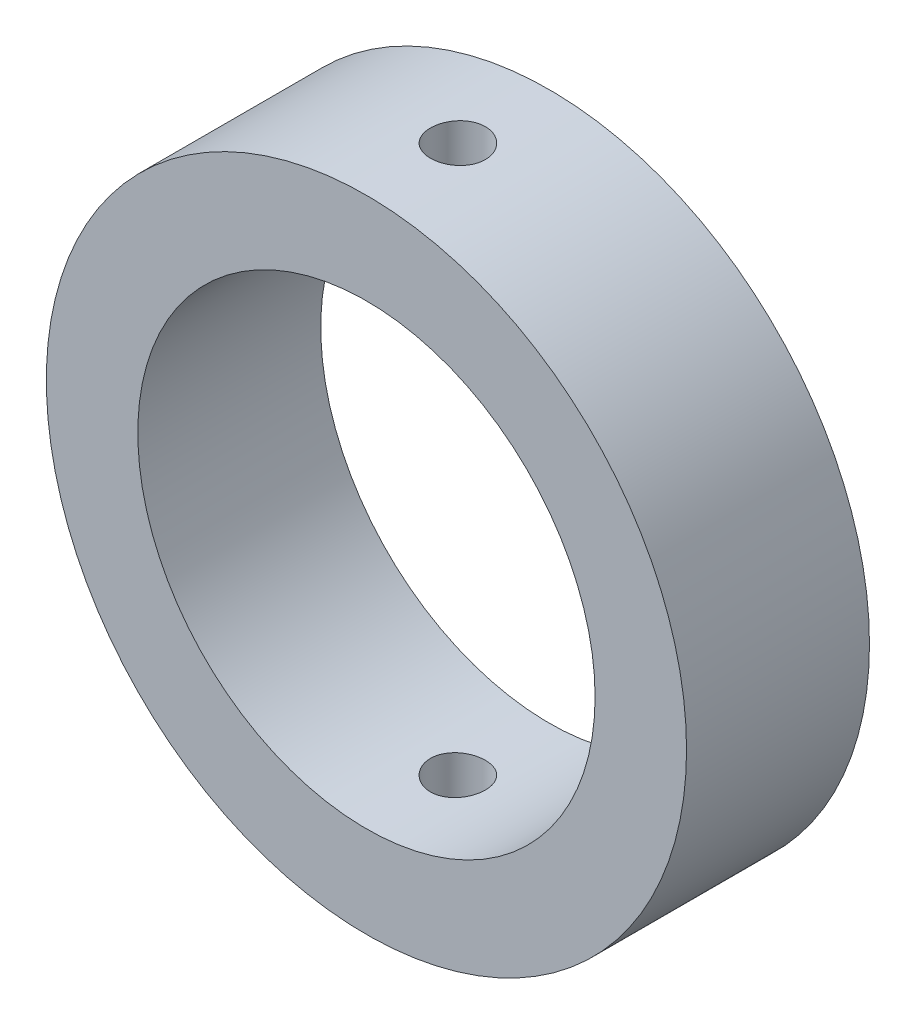
ISO-10303-21;
HEADER;
FILE_DESCRIPTION(('STEP AP214'),'2;1');
FILE_NAME('part.step','',(''),(''),'','','');
FILE_SCHEMA(('AUTOMOTIVE_DESIGN { 1 0 10303 214 1 1 1 1 }'));
ENDSEC;
DATA;
#1=APPLICATION_CONTEXT('core data for automotive mechanical design processes');
#2=APPLICATION_PROTOCOL_DEFINITION('international standard','automotive_design',2000,#1);
#3=PRODUCT_CONTEXT('',#1,'mechanical');
#4=PRODUCT('Part','Part','',(#3));
#5=PRODUCT_RELATED_PRODUCT_CATEGORY('part','',(#4));
#6=PRODUCT_DEFINITION_FORMATION('','',#4);
#7=PRODUCT_DEFINITION_CONTEXT('part definition',#1,'design');
#8=PRODUCT_DEFINITION('design','',#6,#7);
#9=PRODUCT_DEFINITION_SHAPE('','',#8);
#10=(LENGTH_UNIT() NAMED_UNIT(*) SI_UNIT(.MILLI.,.METRE.));
#11=(NAMED_UNIT(*) PLANE_ANGLE_UNIT() SI_UNIT($,.RADIAN.));
#12=(NAMED_UNIT(*) SI_UNIT($,.STERADIAN.) SOLID_ANGLE_UNIT());
#13=UNCERTAINTY_MEASURE_WITH_UNIT(LENGTH_MEASURE(1.E-05),#10,'distance_accuracy_value','');
#14=(GEOMETRIC_REPRESENTATION_CONTEXT(3) GLOBAL_UNCERTAINTY_ASSIGNED_CONTEXT((#13)) GLOBAL_UNIT_ASSIGNED_CONTEXT((#10,
#11,#12)) REPRESENTATION_CONTEXT('',''));
#15=CARTESIAN_POINT('',(0.,0.,0.));
#16=DIRECTION('',(0.,0.,1.));
#17=DIRECTION('',(1.,0.,0.));
#18=AXIS2_PLACEMENT_3D('',#15,#16,#17);
#19=CARTESIAN_POINT('',(0.,0.,10.));
#20=DIRECTION('',(0.,0.,1.));
#21=DIRECTION('',(1.,0.,0.));
#22=AXIS2_PLACEMENT_3D('',#19,#20,#21);
#23=PLANE('',#22);
#24=CARTESIAN_POINT('',(0.,0.,10.));
#25=DIRECTION('',(0.,0.,1.));
#26=DIRECTION('',(1.,0.,0.));
#27=AXIS2_PLACEMENT_3D('',#24,#25,#26);
#28=CIRCLE('',#27,35.);
#29=CARTESIAN_POINT('',(35.,0.,10.));
#30=VERTEX_POINT('',#29);
#31=EDGE_CURVE('E12',#30,#30,#28,.T.);
#32=ORIENTED_EDGE('',*,*,#31,.T.);
#33=EDGE_LOOP('',(#32));
#34=FACE_BOUND('',#33,.T.);
#35=CARTESIAN_POINT('',(0.,0.,10.));
#36=DIRECTION('',(0.,0.,1.));
#37=DIRECTION('',(1.,0.,0.));
#38=AXIS2_PLACEMENT_3D('',#35,#36,#37);
#39=CIRCLE('',#38,25.);
#40=CARTESIAN_POINT('',(25.,0.,10.));
#41=VERTEX_POINT('',#40);
#42=EDGE_CURVE('E67',#41,#41,#39,.T.);
#43=ORIENTED_EDGE('',*,*,#42,.F.);
#44=EDGE_LOOP('',(#43));
#45=FACE_BOUND('',#44,.T.);
#46=ADVANCED_FACE('F48',(#34,#45),#23,.T.);
#47=CARTESIAN_POINT('',(0.,0.,-10.));
#48=DIRECTION('',(0.,0.,1.));
#49=DIRECTION('',(1.,0.,0.));
#50=AXIS2_PLACEMENT_3D('',#47,#48,#49);
#51=PLANE('',#50);
#52=CARTESIAN_POINT('',(0.,0.,-10.));
#53=DIRECTION('',(0.,0.,1.));
#54=DIRECTION('',(1.,0.,0.));
#55=AXIS2_PLACEMENT_3D('',#52,#53,#54);
#56=CIRCLE('',#55,35.);
#57=CARTESIAN_POINT('',(35.,0.,-10.));
#58=VERTEX_POINT('',#57);
#59=EDGE_CURVE('E62',#58,#58,#56,.T.);
#60=ORIENTED_EDGE('',*,*,#59,.F.);
#61=EDGE_LOOP('',(#60));
#62=FACE_BOUND('',#61,.T.);
#63=CARTESIAN_POINT('',(0.,0.,-10.));
#64=DIRECTION('',(0.,0.,1.));
#65=DIRECTION('',(1.,0.,0.));
#66=AXIS2_PLACEMENT_3D('',#63,#64,#65);
#67=CIRCLE('',#66,25.);
#68=CARTESIAN_POINT('',(25.,0.,-10.));
#69=VERTEX_POINT('',#68);
#70=EDGE_CURVE('E70',#69,#69,#67,.T.);
#71=ORIENTED_EDGE('',*,*,#70,.T.);
#72=EDGE_LOOP('',(#71));
#73=FACE_BOUND('',#72,.T.);
#74=ADVANCED_FACE('F106',(#62,#73),#51,.F.);
#75=CARTESIAN_POINT('',(0.,0.,10.));
#76=DIRECTION('',(0.,0.,-1.));
#77=DIRECTION('',(-1.,0.,0.));
#78=AXIS2_PLACEMENT_3D('',#75,#76,#77);
#79=CYLINDRICAL_SURFACE('',#78,35.);
#80=CARTESIAN_POINT('',(0.,-35.,3.));
#81=CARTESIAN_POINT('',(0.168180177421425,-34.9999983189466,2.99999266210863));
#82=CARTESIAN_POINT('',(0.336474410694065,-34.9987748870089,2.98581013771319));
#83=CARTESIAN_POINT('',(0.668405276387218,-34.9940120055983,2.92944276622912));
#84=CARTESIAN_POINT('',(0.832036433522409,-34.9904699418268,2.8872263096079));
#85=CARTESIAN_POINT('',(1.14978580604664,-34.9814700099417,2.77602193084886));
#86=CARTESIAN_POINT('',(1.30390939390644,-34.9760132356579,2.70704929153068));
#87=CARTESIAN_POINT('',(1.5983553572425,-34.9637955952331,2.54431808404178));
#88=CARTESIAN_POINT('',(1.7386806487592,-34.9570350055299,2.45056476836747));
#89=CARTESIAN_POINT('',(2.00196024172095,-34.9429478698077,2.2406617110507));
#90=CARTESIAN_POINT('',(2.12487233650439,-34.9356200130701,2.12445911320051));
#91=CARTESIAN_POINT('',(2.34947428548936,-34.9212352148941,1.87306791064407));
#92=CARTESIAN_POINT('',(2.45116320107853,-34.9141782854488,1.73787846667126));
#93=CARTESIAN_POINT('',(2.63057608789141,-34.9011203668809,1.45209423905735));
#94=CARTESIAN_POINT('',(2.7082627988584,-34.895121025662,1.30147598200075));
#95=CARTESIAN_POINT('',(2.83722803822897,-34.8848727505605,0.989273104177588));
#96=CARTESIAN_POINT('',(2.88850705745045,-34.8806237841455,0.827688687293139));
#97=CARTESIAN_POINT('',(2.96307845769353,-34.8743684880487,0.498564355710717));
#98=CARTESIAN_POINT('',(2.98643979537529,-34.8723566335604,0.331040171612378));
#99=CARTESIAN_POINT('',(3.00472573441206,-34.8707859372111,-0.00556268433017046));
#100=CARTESIAN_POINT('',(2.99965089755265,-34.8712270468893,-0.174641325398614));
#101=CARTESIAN_POINT('',(2.96126551313284,-34.874507414771,-0.509080649907536));
#102=CARTESIAN_POINT('',(2.92802995365881,-34.8773403039272,-0.674450011339011));
#103=CARTESIAN_POINT('',(2.83438308452453,-34.8850750500347,-0.997254501244544));
#104=CARTESIAN_POINT('',(2.77397149596722,-34.8899769282191,-1.15468954827337));
#105=CARTESIAN_POINT('',(2.62760362876988,-34.9013046627491,-1.4573951023907));
#106=CARTESIAN_POINT('',(2.54161375570937,-34.9077325210554,-1.60264928754069));
#107=CARTESIAN_POINT('',(2.34655446417304,-34.9213861292491,-1.87669137617524));
#108=CARTESIAN_POINT('',(2.23748455081154,-34.9286118962437,-2.00547892648475));
#109=CARTESIAN_POINT('',(1.99894091774494,-34.9430754969892,-2.24336792176387));
#110=CARTESIAN_POINT('',(1.86940237855328,-34.9503132942366,-2.35240438166867));
#111=CARTESIAN_POINT('',(1.59382461581758,-34.9639632077666,-2.54719343707745));
#112=CARTESIAN_POINT('',(1.44778538038973,-34.9703753234546,-2.63294601581221));
#113=CARTESIAN_POINT('',(1.1433091368017,-34.9816527329005,-2.7787292518991));
#114=CARTESIAN_POINT('',(0.984870717201056,-34.9865178502383,-2.83875697585377));
#115=CARTESIAN_POINT('',(0.660113221128348,-34.9941511080319,-2.93134075665488));
#116=CARTESIAN_POINT('',(0.493794317781496,-34.9969192945321,-2.96389741671388));
#117=CARTESIAN_POINT('',(0.15856025083397,-35.0000408811527,-3.00053330208984));
#118=CARTESIAN_POINT('',(-0.0103450366761299,-35.0004018916599,-3.00470227713832));
#119=CARTESIAN_POINT('',(-0.346452104482659,-34.9986887867208,-2.98467964423468));
#120=CARTESIAN_POINT('',(-0.513653901587615,-34.9966146953254,-2.96048831639071));
#121=CARTESIAN_POINT('',(-0.841351421558965,-34.9902695086844,-2.88450617766359));
#122=CARTESIAN_POINT('',(-1.00185687270474,-34.9860017297263,-2.83275702283699));
#123=CARTESIAN_POINT('',(-1.31190702245475,-34.9757485102754,-2.70317077993439));
#124=CARTESIAN_POINT('',(-1.46145153801856,-34.9697630411066,-2.62533325632064));
#125=CARTESIAN_POINT('',(-1.74574288167439,-34.9567262474856,-2.44555464705531));
#126=CARTESIAN_POINT('',(-1.88045202960911,-34.9496723123826,-2.34355416847324));
#127=CARTESIAN_POINT('',(-2.13086824169311,-34.9352996751561,-2.11843078007551));
#128=CARTESIAN_POINT('',(-2.24657495644839,-34.9279809681673,-1.99530748196383));
#129=CARTESIAN_POINT('',(-2.45601016602155,-34.9138810732733,-1.73104373026091));
#130=CARTESIAN_POINT('',(-2.54968004901865,-34.9071013498897,-1.58985673643766));
#131=CARTESIAN_POINT('',(-2.71198063229128,-34.8948680127784,-1.29370475497806));
#132=CARTESIAN_POINT('',(-2.78061159495576,-34.8894143851545,-1.1387399117443));
#133=CARTESIAN_POINT('',(-2.8907865424564,-34.8804590783593,-0.819637788875996));
#134=CARTESIAN_POINT('',(-2.93236627395852,-34.8769548240937,-0.655512926555938));
#135=CARTESIAN_POINT('',(-2.98737479633476,-34.872286503041,-0.322579942622132));
#136=CARTESIAN_POINT('',(-3.0008041627162,-34.871122388412,-0.153771916822677));
#137=CARTESIAN_POINT('',(-2.99912392353084,-34.8712668950776,0.183153064790337));
#138=CARTESIAN_POINT('',(-2.98410640669543,-34.8725675374248,0.351270490928937));
#139=CARTESIAN_POINT('',(-2.92615085557176,-34.8774780477604,0.682585927448216));
#140=CARTESIAN_POINT('',(-2.88321277999481,-34.8810879191635,0.845783930553722));
#141=CARTESIAN_POINT('',(-2.7706585792072,-34.8902080316544,1.16263302157389));
#142=CARTESIAN_POINT('',(-2.70104425727074,-34.8957181442861,1.31628475398639));
#143=CARTESIAN_POINT('',(-2.53712384137618,-34.9080181097009,1.60973557579742));
#144=CARTESIAN_POINT('',(-2.4428181018962,-34.9148079441114,1.74953486402647));
#145=CARTESIAN_POINT('',(-2.23184571903132,-34.9289284828144,2.01178384593965));
#146=CARTESIAN_POINT('',(-2.11511080731054,-34.9362607952504,2.13417853301693));
#147=CARTESIAN_POINT('',(-1.86271960746937,-34.9506254222313,2.357688026767));
#148=CARTESIAN_POINT('',(-1.72705875414518,-34.9576576638589,2.45879768438289));
#149=CARTESIAN_POINT('',(-1.44039065385252,-34.9706432183248,2.63701082844132));
#150=CARTESIAN_POINT('',(-1.28935405311577,-34.9765944046818,2.71406721034553));
#151=CARTESIAN_POINT('',(-0.976537475486434,-34.9867226680456,2.84162677766724));
#152=CARTESIAN_POINT('',(-0.81477005805675,-34.9909017781752,2.89216040885072));
#153=CARTESIAN_POINT('',(-0.543377751492648,-34.9959451685553,2.95240549430712));
#154=CARTESIAN_POINT('',(-0.435496910992703,-34.9974587860022,2.97022962445315));
#155=CARTESIAN_POINT('',(-0.218426750644095,-34.999486746251,2.99402924356659));
#156=CARTESIAN_POINT('',(-0.109237434508939,-35.0000010918883,3.00000476615283));
#157=CARTESIAN_POINT('',(0.,-35.,3.));
#158=B_SPLINE_CURVE_WITH_KNOTS('',3,(#80,#81,#82,#83,#84,#85,#86,#87,#88,#89,#90,#91,#92,#93,
#94,#95,#96,#97,#98,#99,#100,#101,#102,#103,#104,#105,#106,#107,#108,#109,#110,#111,#112,#113,
#114,#115,#116,#117,#118,#119,#120,#121,#122,#123,#124,#125,#126,#127,#128,#129,#130,#131,#132,
#133,#134,#135,#136,#137,#138,#139,#140,#141,#142,#143,#144,#145,#146,#147,#148,#149,#150,#151,
#152,#153,#154,#155,#156,#157),.UNSPECIFIED.,.T.,.F.,(4,2,2,2,2,2,2,2,2,2,2,2,2,2,2,2,2,2,2,2,2,
2,2,2,2,2,2,2,2,2,2,2,2,2,2,2,2,2,4),(0.,0.504141688620747,1.00885278730409,1.51327602436422,
2.01759242981481,2.5231110330061,3.02865198843329,3.53497383147414,4.04128626359052,
4.54634550220951,5.05139476290399,5.55510335902216,6.05881712462464,6.56319540924794,
7.06758450992202,7.57360414720596,8.07962414892789,8.58570183661505,9.09176841150507,
9.59623427417642,10.1006951543972,10.6043956535469,11.1081045622491,11.6130646830275,
12.1180340873686,12.6243317573245,13.1306241215114,13.636246082805,14.1418577070399,
14.6458353534655,15.1498137451707,15.6537580747011,16.1576951698375,16.6631911333163,
17.1688092410494,17.6754113983993,18.1814307424438,18.5088849156758,18.8363381597994),.UNSPECIFIED.);
#159=CARTESIAN_POINT('',(0.,-35.,3.));
#160=VERTEX_POINT('',#159);
#161=EDGE_CURVE('E95',#160,#160,#158,.T.);
#162=ORIENTED_EDGE('',*,*,#161,.T.);
#163=EDGE_LOOP('',(#162));
#164=FACE_BOUND('',#163,.T.);
#165=CARTESIAN_POINT('',(0.,35.,3.));
#166=CARTESIAN_POINT('',(-0.168180177421425,34.9999983189466,2.99999266210863));
#167=CARTESIAN_POINT('',(-0.336474410694065,34.9987748870089,2.98581013771319));
#168=CARTESIAN_POINT('',(-0.668405276387218,34.9940120055983,2.92944276622912));
#169=CARTESIAN_POINT('',(-0.832036433522409,34.9904699418268,2.8872263096079));
#170=CARTESIAN_POINT('',(-1.14978580604664,34.9814700099417,2.77602193084886));
#171=CARTESIAN_POINT('',(-1.30390939390644,34.9760132356579,2.70704929153068));
#172=CARTESIAN_POINT('',(-1.5983553572425,34.9637955952331,2.54431808404178));
#173=CARTESIAN_POINT('',(-1.7386806487592,34.9570350055299,2.45056476836747));
#174=CARTESIAN_POINT('',(-2.00196024172095,34.9429478698077,2.2406617110507));
#175=CARTESIAN_POINT('',(-2.12487233650439,34.9356200130701,2.12445911320051));
#176=CARTESIAN_POINT('',(-2.34947428548936,34.9212352148941,1.87306791064407));
#177=CARTESIAN_POINT('',(-2.45116320107853,34.9141782854488,1.73787846667126));
#178=CARTESIAN_POINT('',(-2.63057608789141,34.9011203668809,1.45209423905735));
#179=CARTESIAN_POINT('',(-2.7082627988584,34.895121025662,1.30147598200075));
#180=CARTESIAN_POINT('',(-2.83722803822897,34.8848727505605,0.989273104177588));
#181=CARTESIAN_POINT('',(-2.88850705745045,34.8806237841455,0.827688687293139));
#182=CARTESIAN_POINT('',(-2.96307845769353,34.8743684880487,0.498564355710717));
#183=CARTESIAN_POINT('',(-2.98643979537529,34.8723566335604,0.331040171612378));
#184=CARTESIAN_POINT('',(-3.00472573441206,34.8707859372111,-0.00556268433017046));
#185=CARTESIAN_POINT('',(-2.99965089755265,34.8712270468893,-0.174641325398614));
#186=CARTESIAN_POINT('',(-2.96126551313284,34.874507414771,-0.509080649907536));
#187=CARTESIAN_POINT('',(-2.92802995365881,34.8773403039272,-0.674450011339011));
#188=CARTESIAN_POINT('',(-2.83438308452453,34.8850750500347,-0.997254501244544));
#189=CARTESIAN_POINT('',(-2.77397149596722,34.8899769282191,-1.15468954827337));
#190=CARTESIAN_POINT('',(-2.62760362876988,34.9013046627491,-1.4573951023907));
#191=CARTESIAN_POINT('',(-2.54161375570937,34.9077325210554,-1.60264928754069));
#192=CARTESIAN_POINT('',(-2.34655446417304,34.9213861292491,-1.87669137617524));
#193=CARTESIAN_POINT('',(-2.23748455081154,34.9286118962437,-2.00547892648475));
#194=CARTESIAN_POINT('',(-1.99894091774494,34.9430754969892,-2.24336792176387));
#195=CARTESIAN_POINT('',(-1.86940237855328,34.9503132942366,-2.35240438166867));
#196=CARTESIAN_POINT('',(-1.59382461581758,34.9639632077666,-2.54719343707745));
#197=CARTESIAN_POINT('',(-1.44778538038973,34.9703753234546,-2.63294601581221));
#198=CARTESIAN_POINT('',(-1.1433091368017,34.9816527329005,-2.7787292518991));
#199=CARTESIAN_POINT('',(-0.984870717201056,34.9865178502383,-2.83875697585377));
#200=CARTESIAN_POINT('',(-0.660113221128348,34.9941511080319,-2.93134075665488));
#201=CARTESIAN_POINT('',(-0.493794317781496,34.9969192945321,-2.96389741671388));
#202=CARTESIAN_POINT('',(-0.15856025083397,35.0000408811527,-3.00053330208984));
#203=CARTESIAN_POINT('',(0.0103450366761299,35.0004018916599,-3.00470227713832));
#204=CARTESIAN_POINT('',(0.346452104482659,34.9986887867208,-2.98467964423468));
#205=CARTESIAN_POINT('',(0.513653901587615,34.9966146953254,-2.96048831639071));
#206=CARTESIAN_POINT('',(0.841351421558965,34.9902695086844,-2.88450617766359));
#207=CARTESIAN_POINT('',(1.00185687270474,34.9860017297263,-2.83275702283699));
#208=CARTESIAN_POINT('',(1.31190702245475,34.9757485102754,-2.70317077993439));
#209=CARTESIAN_POINT('',(1.46145153801856,34.9697630411066,-2.62533325632064));
#210=CARTESIAN_POINT('',(1.74574288167439,34.9567262474856,-2.44555464705531));
#211=CARTESIAN_POINT('',(1.88045202960911,34.9496723123826,-2.34355416847324));
#212=CARTESIAN_POINT('',(2.13086824169311,34.9352996751561,-2.11843078007551));
#213=CARTESIAN_POINT('',(2.24657495644839,34.9279809681673,-1.99530748196383));
#214=CARTESIAN_POINT('',(2.45601016602155,34.9138810732733,-1.73104373026091));
#215=CARTESIAN_POINT('',(2.54968004901865,34.9071013498897,-1.58985673643766));
#216=CARTESIAN_POINT('',(2.71198063229128,34.8948680127784,-1.29370475497806));
#217=CARTESIAN_POINT('',(2.78061159495576,34.8894143851545,-1.1387399117443));
#218=CARTESIAN_POINT('',(2.8907865424564,34.8804590783593,-0.819637788875996));
#219=CARTESIAN_POINT('',(2.93236627395852,34.8769548240937,-0.655512926555938));
#220=CARTESIAN_POINT('',(2.98737479633476,34.872286503041,-0.322579942622132));
#221=CARTESIAN_POINT('',(3.0008041627162,34.871122388412,-0.153771916822677));
#222=CARTESIAN_POINT('',(2.99912392353084,34.8712668950776,0.183153064790337));
#223=CARTESIAN_POINT('',(2.98410640669543,34.8725675374248,0.351270490928937));
#224=CARTESIAN_POINT('',(2.92615085557176,34.8774780477604,0.682585927448216));
#225=CARTESIAN_POINT('',(2.88321277999481,34.8810879191635,0.845783930553722));
#226=CARTESIAN_POINT('',(2.7706585792072,34.8902080316544,1.16263302157389));
#227=CARTESIAN_POINT('',(2.70104425727074,34.8957181442861,1.31628475398639));
#228=CARTESIAN_POINT('',(2.53712384137618,34.9080181097009,1.60973557579742));
#229=CARTESIAN_POINT('',(2.4428181018962,34.9148079441114,1.74953486402647));
#230=CARTESIAN_POINT('',(2.23184571903132,34.9289284828144,2.01178384593965));
#231=CARTESIAN_POINT('',(2.11511080731054,34.9362607952504,2.13417853301693));
#232=CARTESIAN_POINT('',(1.86271960746937,34.9506254222313,2.357688026767));
#233=CARTESIAN_POINT('',(1.72705875414518,34.9576576638589,2.45879768438289));
#234=CARTESIAN_POINT('',(1.44039065385252,34.9706432183248,2.63701082844132));
#235=CARTESIAN_POINT('',(1.28935405311577,34.9765944046818,2.71406721034553));
#236=CARTESIAN_POINT('',(0.976537475486434,34.9867226680456,2.84162677766724));
#237=CARTESIAN_POINT('',(0.81477005805675,34.9909017781752,2.89216040885072));
#238=CARTESIAN_POINT('',(0.543377751492648,34.9959451685553,2.95240549430712));
#239=CARTESIAN_POINT('',(0.435496910992703,34.9974587860022,2.97022962445315));
#240=CARTESIAN_POINT('',(0.218426750644095,34.999486746251,2.99402924356659));
#241=CARTESIAN_POINT('',(0.109237434508939,35.0000010918883,3.00000476615283));
#242=CARTESIAN_POINT('',(0.,35.,3.));
#243=B_SPLINE_CURVE_WITH_KNOTS('',3,(#165,#166,#167,#168,#169,#170,#171,#172,#173,#174,#175,
#176,#177,#178,#179,#180,#181,#182,#183,#184,#185,#186,#187,#188,#189,#190,#191,#192,#193,#194,
#195,#196,#197,#198,#199,#200,#201,#202,#203,#204,#205,#206,#207,#208,#209,#210,#211,#212,#213,
#214,#215,#216,#217,#218,#219,#220,#221,#222,#223,#224,#225,#226,#227,#228,#229,#230,#231,#232,
#233,#234,#235,#236,#237,#238,#239,#240,#241,#242),.UNSPECIFIED.,.T.,.F.,(4,2,2,2,2,2,2,2,2,2,2,
2,2,2,2,2,2,2,2,2,2,2,2,2,2,2,2,2,2,2,2,2,2,2,2,2,2,2,4),(0.,0.504141688620747,1.00885278730409,
1.51327602436422,2.01759242981481,2.5231110330061,3.02865198843329,3.53497383147414,
4.04128626359052,4.54634550220951,5.05139476290399,5.55510335902216,6.05881712462464,
6.56319540924794,7.06758450992202,7.57360414720596,8.07962414892789,8.58570183661505,
9.09176841150507,9.59623427417642,10.1006951543972,10.6043956535469,11.1081045622491,
11.6130646830275,12.1180340873686,12.6243317573245,13.1306241215114,13.636246082805,
14.1418577070399,14.6458353534655,15.1498137451707,15.6537580747011,16.1576951698375,
16.6631911333163,17.1688092410494,17.6754113983993,18.1814307424438,18.5088849156758,
18.8363381597994),.UNSPECIFIED.);
#244=CARTESIAN_POINT('',(0.,35.,3.));
#245=VERTEX_POINT('',#244);
#246=EDGE_CURVE('E90',#245,#245,#243,.T.);
#247=ORIENTED_EDGE('',*,*,#246,.T.);
#248=EDGE_LOOP('',(#247));
#249=FACE_BOUND('',#248,.T.);
#250=ORIENTED_EDGE('',*,*,#31,.F.);
#251=EDGE_LOOP('',(#250));
#252=FACE_BOUND('',#251,.T.);
#253=ORIENTED_EDGE('',*,*,#59,.T.);
#254=EDGE_LOOP('',(#253));
#255=FACE_BOUND('',#254,.T.);
#256=ADVANCED_FACE('F50',(#164,#249,#252,#255),#79,.T.);
#257=CARTESIAN_POINT('',(0.,0.,10.));
#258=DIRECTION('',(0.,0.,-1.));
#259=DIRECTION('',(-1.,0.,0.));
#260=AXIS2_PLACEMENT_3D('',#257,#258,#259);
#261=CYLINDRICAL_SURFACE('',#260,25.);
#262=CARTESIAN_POINT('',(0.,-25.,3.));
#263=CARTESIAN_POINT('',(0.167864047107699,-24.9999977357459,2.99999283605856));
#264=CARTESIAN_POINT('',(0.335834317331191,-24.9982914200408,2.98586334130731));
#265=CARTESIAN_POINT('',(0.667104571308249,-24.991648705422,2.92971893584462));
#266=CARTESIAN_POINT('',(0.830399429590069,-24.9867088933728,2.88767455874941));
#267=CARTESIAN_POINT('',(1.14747479534053,-24.9741559265426,2.77695372347398));
#268=CARTESIAN_POINT('',(1.30126148759225,-24.9665445315309,2.70829479317582));
#269=CARTESIAN_POINT('',(1.595099157832,-24.9494959264345,2.5463312649167));
#270=CARTESIAN_POINT('',(1.73515256713516,-24.9400590404141,2.45303104024669));
#271=CARTESIAN_POINT('',(1.99829131534451,-24.920360105442,2.24392513802476));
#272=CARTESIAN_POINT('',(2.1212966913072,-24.9100945030904,2.12801915988808));
#273=CARTESIAN_POINT('',(2.34615931038342,-24.8899239397152,1.8772070351121));
#274=CARTESIAN_POINT('',(2.44801549826473,-24.8800189967068,1.74229994098135));
#275=CARTESIAN_POINT('',(2.62798342873896,-24.8616560370405,1.45679917470162));
#276=CARTESIAN_POINT('',(2.7060207567257,-24.8532025903971,1.30615827541986));
#277=CARTESIAN_POINT('',(2.8356605730156,-24.8387461344686,0.993791297891255));
#278=CARTESIAN_POINT('',(2.88726398696776,-24.8327430393798,0.832065608030697));
#279=CARTESIAN_POINT('',(2.96232930045399,-24.8239006073737,0.502947140688577));
#280=CARTESIAN_POINT('',(2.98592577987646,-24.8210461452543,0.335585471572323));
#281=CARTESIAN_POINT('',(3.0047237521967,-24.8187777690611,-0.000744936364164487));
#282=CARTESIAN_POINT('',(2.99992630052848,-24.8193637271033,-0.169713615216966));
#283=CARTESIAN_POINT('',(2.96218316078668,-24.8238961466306,-0.503525964784349));
#284=CARTESIAN_POINT('',(2.92938543222302,-24.8278249434675,-0.668386638680178));
#285=CARTESIAN_POINT('',(2.83680346170067,-24.8385728087608,-0.99024702782136));
#286=CARTESIAN_POINT('',(2.77701871225814,-24.8453919315688,-1.147246595179));
#287=CARTESIAN_POINT('',(2.63199980699861,-24.8611722079476,-1.44938946823911));
#288=CARTESIAN_POINT('',(2.54670106203925,-24.8701387862198,-1.59450147835355));
#289=CARTESIAN_POINT('',(2.35312173169469,-24.8891993987901,-1.86840721091576));
#290=CARTESIAN_POINT('',(2.24484017723156,-24.8992934806213,-1.99720024490257));
#291=CARTESIAN_POINT('',(2.0075475556218,-24.9195503308637,-2.23567108436438));
#292=CARTESIAN_POINT('',(1.87840890051216,-24.929713127424,-2.34522196985706));
#293=CARTESIAN_POINT('',(1.60350795893872,-24.9489020798549,-2.54111152100031));
#294=CARTESIAN_POINT('',(1.45774563908005,-24.9579282334421,-2.62745014001915));
#295=CARTESIAN_POINT('',(1.15363930826284,-24.9738318861702,-2.77446328563966));
#296=CARTESIAN_POINT('',(0.99529157871559,-24.9807087472809,-2.83513019333044));
#297=CARTESIAN_POINT('',(0.670556022273439,-24.991533065309,-2.9289787378509));
#298=CARTESIAN_POINT('',(0.504168542441622,-24.9954806485584,-2.96216156000448));
#299=CARTESIAN_POINT('',(0.169174396374217,-24.9999852500304,-2.99993625549769));
#300=CARTESIAN_POINT('',(0.000587720432052285,-25.0005630093753,-3.0047030324007));
#301=CARTESIAN_POINT('',(-0.334982068243259,-24.9983187823231,-2.98597142213173));
#302=CARTESIAN_POINT('',(-0.501965212327328,-24.9954968625308,-2.96247358870464));
#303=CARTESIAN_POINT('',(-0.829074263928356,-24.9867833380686,-2.88802503599691));
#304=CARTESIAN_POINT('',(-0.989219346369034,-24.9809010237909,-2.83715738694992));
#305=CARTESIAN_POINT('',(-1.29870539768646,-24.9667255501792,-2.70949929664642));
#306=CARTESIAN_POINT('',(-1.44804602592347,-24.9584323148759,-2.63270803850991));
#307=CARTESIAN_POINT('',(-1.73246717766504,-24.9403085158695,-2.45495708409757));
#308=CARTESIAN_POINT('',(-1.86747628962751,-24.9304708084643,-2.35388386218918));
#309=CARTESIAN_POINT('',(-2.11867625152203,-24.9103817919419,-2.13059915359183));
#310=CARTESIAN_POINT('',(-2.23486641472949,-24.9001304677484,-2.00838689585205));
#311=CARTESIAN_POINT('',(-2.44574795226153,-24.8803059484942,-1.74552438457231));
#312=CARTESIAN_POINT('',(-2.54032363231939,-24.8707365831307,-1.60478098465615));
#313=CARTESIAN_POINT('',(-2.70449314429332,-24.8534214993383,-1.30930497492444));
#314=CARTESIAN_POINT('',(-2.77408744356074,-24.8456757467943,-1.15457262688176));
#315=CARTESIAN_POINT('',(-2.88612996668159,-24.8329105734502,-0.835889391105305));
#316=CARTESIAN_POINT('',(-2.92864420159346,-24.8278845275633,-0.67196198814061));
#317=CARTESIAN_POINT('',(-2.98553272163516,-24.8211085274587,-0.339231030514934));
#318=CARTESIAN_POINT('',(-2.99990820526081,-24.8193584337106,-0.170427683842675));
#319=CARTESIAN_POINT('',(-3.00009033817931,-24.819336326607,0.166112729637173));
#320=CARTESIAN_POINT('',(-2.98607873671351,-24.8210421863943,0.333849725771265));
#321=CARTESIAN_POINT('',(-2.93026848672089,-24.8276922947425,0.664566786394168));
#322=CARTESIAN_POINT('',(-2.88846982822067,-24.8326365444656,0.827546849175586));
#323=CARTESIAN_POINT('',(-2.77832739820545,-24.8451996524586,1.1441045388887));
#324=CARTESIAN_POINT('',(-2.70999165570539,-24.8528177016812,1.29768499349548));
#325=CARTESIAN_POINT('',(-2.54873282628009,-24.8698714539139,1.5912277470701));
#326=CARTESIAN_POINT('',(-2.45580952709445,-24.8793071726153,1.7311899284593));
#327=CARTESIAN_POINT('',(-2.24733689647205,-24.8990055122588,1.99445294010884));
#328=CARTESIAN_POINT('',(-2.1316520393015,-24.9092728581347,2.11764610326628));
#329=CARTESIAN_POINT('',(-1.88122093334447,-24.9294354968169,2.342942479566));
#330=CARTESIAN_POINT('',(-1.74647018263601,-24.939330701051,2.44504069762919));
#331=CARTESIAN_POINT('',(-1.46119322465137,-24.9576721709324,2.62555057799886));
#332=CARTESIAN_POINT('',(-1.31061323462418,-24.966113221621,2.70387772572229));
#333=CARTESIAN_POINT('',(-0.998422751685312,-24.9805418519727,2.83402376444257));
#334=CARTESIAN_POINT('',(-0.836824564362144,-24.9865321180615,2.88587169618039));
#335=CARTESIAN_POINT('',(-0.561977101236696,-24.9939268325999,2.94906342033812));
#336=CARTESIAN_POINT('',(-0.450466569753485,-24.996193279433,2.96813748388637));
#337=CARTESIAN_POINT('',(-0.225986735693693,-24.9992306204204,2.99360814349096));
#338=CARTESIAN_POINT('',(-0.113017442753625,-25.0000015244492,3.00000482325045));
#339=CARTESIAN_POINT('',(0.,-25.,3.));
#340=B_SPLINE_CURVE_WITH_KNOTS('',3,(#262,#263,#264,#265,#266,#267,#268,#269,#270,#271,#272,
#273,#274,#275,#276,#277,#278,#279,#280,#281,#282,#283,#284,#285,#286,#287,#288,#289,#290,#291,
#292,#293,#294,#295,#296,#297,#298,#299,#300,#301,#302,#303,#304,#305,#306,#307,#308,#309,#310,
#311,#312,#313,#314,#315,#316,#317,#318,#319,#320,#321,#322,#323,#324,#325,#326,#327,#328,#329,
#330,#331,#332,#333,#334,#335,#336,#337,#338,#339),.UNSPECIFIED.,.T.,.F.,(4,2,2,2,2,2,2,2,2,2,2,
2,2,2,2,2,2,2,2,2,2,2,2,2,2,2,2,2,2,2,2,2,2,2,2,2,2,2,4),(0.,0.503179350956159,1.00689069408623,
1.5102708637556,2.01356175441693,2.51913872195878,3.02474090904883,3.53190689496397,
4.03905511999113,4.54375638343279,5.0484388866848,5.55047092912253,6.05251241253396,
6.55583573710536,7.05918028869262,7.56572944640317,8.07227962172601,8.57898002694278,
9.08565857822619,9.58921522624226,10.0927620090108,10.5947890255775,11.0968318630167,
11.6012692178556,12.1057249760356,12.6128207581672,13.119907053063,13.6257524826489,
14.1315763666154,14.6341719319229,15.1367676776234,15.6392114771388,16.1416596143121,
16.6471952402032,17.1528504352009,17.6602829023946,18.1671576479275,18.5059342945627,
18.8447087043981),.UNSPECIFIED.);
#341=CARTESIAN_POINT('',(0.,-25.,3.));
#342=VERTEX_POINT('',#341);
#343=EDGE_CURVE('E53',#342,#342,#340,.T.);
#344=ORIENTED_EDGE('',*,*,#343,.F.);
#345=EDGE_LOOP('',(#344));
#346=FACE_BOUND('',#345,.T.);
#347=CARTESIAN_POINT('',(0.,25.,3.));
#348=CARTESIAN_POINT('',(-0.167864047107699,24.9999977357459,2.99999283605856));
#349=CARTESIAN_POINT('',(-0.335834317331191,24.9982914200408,2.98586334130731));
#350=CARTESIAN_POINT('',(-0.667104571308249,24.991648705422,2.92971893584462));
#351=CARTESIAN_POINT('',(-0.830399429590069,24.9867088933728,2.88767455874941));
#352=CARTESIAN_POINT('',(-1.14747479534053,24.9741559265426,2.77695372347398));
#353=CARTESIAN_POINT('',(-1.30126148759225,24.9665445315309,2.70829479317582));
#354=CARTESIAN_POINT('',(-1.595099157832,24.9494959264345,2.5463312649167));
#355=CARTESIAN_POINT('',(-1.73515256713516,24.9400590404141,2.45303104024669));
#356=CARTESIAN_POINT('',(-1.99829131534451,24.920360105442,2.24392513802476));
#357=CARTESIAN_POINT('',(-2.1212966913072,24.9100945030904,2.12801915988808));
#358=CARTESIAN_POINT('',(-2.34615931038342,24.8899239397152,1.8772070351121));
#359=CARTESIAN_POINT('',(-2.44801549826473,24.8800189967068,1.74229994098135));
#360=CARTESIAN_POINT('',(-2.62798342873896,24.8616560370405,1.45679917470162));
#361=CARTESIAN_POINT('',(-2.7060207567257,24.8532025903971,1.30615827541986));
#362=CARTESIAN_POINT('',(-2.8356605730156,24.8387461344686,0.993791297891255));
#363=CARTESIAN_POINT('',(-2.88726398696776,24.8327430393798,0.832065608030697));
#364=CARTESIAN_POINT('',(-2.96232930045399,24.8239006073737,0.502947140688577));
#365=CARTESIAN_POINT('',(-2.98592577987646,24.8210461452543,0.335585471572323));
#366=CARTESIAN_POINT('',(-3.0047237521967,24.8187777690611,-0.000744936364164487));
#367=CARTESIAN_POINT('',(-2.99992630052848,24.8193637271033,-0.169713615216966));
#368=CARTESIAN_POINT('',(-2.96218316078668,24.8238961466306,-0.503525964784349));
#369=CARTESIAN_POINT('',(-2.92938543222302,24.8278249434675,-0.668386638680178));
#370=CARTESIAN_POINT('',(-2.83680346170067,24.8385728087608,-0.99024702782136));
#371=CARTESIAN_POINT('',(-2.77701871225814,24.8453919315688,-1.147246595179));
#372=CARTESIAN_POINT('',(-2.63199980699861,24.8611722079476,-1.44938946823911));
#373=CARTESIAN_POINT('',(-2.54670106203925,24.8701387862198,-1.59450147835355));
#374=CARTESIAN_POINT('',(-2.35312173169469,24.8891993987901,-1.86840721091576));
#375=CARTESIAN_POINT('',(-2.24484017723156,24.8992934806213,-1.99720024490257));
#376=CARTESIAN_POINT('',(-2.0075475556218,24.9195503308637,-2.23567108436438));
#377=CARTESIAN_POINT('',(-1.87840890051216,24.929713127424,-2.34522196985706));
#378=CARTESIAN_POINT('',(-1.60350795893872,24.9489020798549,-2.54111152100031));
#379=CARTESIAN_POINT('',(-1.45774563908005,24.9579282334421,-2.62745014001915));
#380=CARTESIAN_POINT('',(-1.15363930826284,24.9738318861702,-2.77446328563966));
#381=CARTESIAN_POINT('',(-0.99529157871559,24.9807087472809,-2.83513019333044));
#382=CARTESIAN_POINT('',(-0.670556022273439,24.991533065309,-2.9289787378509));
#383=CARTESIAN_POINT('',(-0.504168542441622,24.9954806485584,-2.96216156000448));
#384=CARTESIAN_POINT('',(-0.169174396374217,24.9999852500304,-2.99993625549769));
#385=CARTESIAN_POINT('',(-0.000587720432052285,25.0005630093753,-3.0047030324007));
#386=CARTESIAN_POINT('',(0.334982068243259,24.9983187823231,-2.98597142213173));
#387=CARTESIAN_POINT('',(0.501965212327328,24.9954968625308,-2.96247358870464));
#388=CARTESIAN_POINT('',(0.829074263928356,24.9867833380686,-2.88802503599691));
#389=CARTESIAN_POINT('',(0.989219346369034,24.9809010237909,-2.83715738694992));
#390=CARTESIAN_POINT('',(1.29870539768646,24.9667255501792,-2.70949929664642));
#391=CARTESIAN_POINT('',(1.44804602592347,24.9584323148759,-2.63270803850991));
#392=CARTESIAN_POINT('',(1.73246717766504,24.9403085158695,-2.45495708409757));
#393=CARTESIAN_POINT('',(1.86747628962751,24.9304708084643,-2.35388386218918));
#394=CARTESIAN_POINT('',(2.11867625152203,24.9103817919419,-2.13059915359183));
#395=CARTESIAN_POINT('',(2.23486641472949,24.9001304677484,-2.00838689585205));
#396=CARTESIAN_POINT('',(2.44574795226153,24.8803059484942,-1.74552438457231));
#397=CARTESIAN_POINT('',(2.54032363231939,24.8707365831307,-1.60478098465615));
#398=CARTESIAN_POINT('',(2.70449314429332,24.8534214993383,-1.30930497492444));
#399=CARTESIAN_POINT('',(2.77408744356074,24.8456757467943,-1.15457262688176));
#400=CARTESIAN_POINT('',(2.88612996668159,24.8329105734502,-0.835889391105305));
#401=CARTESIAN_POINT('',(2.92864420159346,24.8278845275633,-0.67196198814061));
#402=CARTESIAN_POINT('',(2.98553272163516,24.8211085274587,-0.339231030514934));
#403=CARTESIAN_POINT('',(2.99990820526081,24.8193584337106,-0.170427683842675));
#404=CARTESIAN_POINT('',(3.00009033817931,24.819336326607,0.166112729637173));
#405=CARTESIAN_POINT('',(2.98607873671351,24.8210421863943,0.333849725771265));
#406=CARTESIAN_POINT('',(2.93026848672089,24.8276922947425,0.664566786394168));
#407=CARTESIAN_POINT('',(2.88846982822067,24.8326365444656,0.827546849175586));
#408=CARTESIAN_POINT('',(2.77832739820545,24.8451996524586,1.1441045388887));
#409=CARTESIAN_POINT('',(2.70999165570539,24.8528177016812,1.29768499349548));
#410=CARTESIAN_POINT('',(2.54873282628009,24.8698714539139,1.5912277470701));
#411=CARTESIAN_POINT('',(2.45580952709445,24.8793071726153,1.7311899284593));
#412=CARTESIAN_POINT('',(2.24733689647205,24.8990055122588,1.99445294010884));
#413=CARTESIAN_POINT('',(2.1316520393015,24.9092728581347,2.11764610326628));
#414=CARTESIAN_POINT('',(1.88122093334447,24.9294354968169,2.342942479566));
#415=CARTESIAN_POINT('',(1.74647018263601,24.939330701051,2.44504069762919));
#416=CARTESIAN_POINT('',(1.46119322465137,24.9576721709324,2.62555057799886));
#417=CARTESIAN_POINT('',(1.31061323462418,24.966113221621,2.70387772572229));
#418=CARTESIAN_POINT('',(0.998422751685312,24.9805418519727,2.83402376444257));
#419=CARTESIAN_POINT('',(0.836824564362144,24.9865321180615,2.88587169618039));
#420=CARTESIAN_POINT('',(0.561977101236696,24.9939268325999,2.94906342033812));
#421=CARTESIAN_POINT('',(0.450466569753485,24.996193279433,2.96813748388637));
#422=CARTESIAN_POINT('',(0.225986735693693,24.9992306204204,2.99360814349096));
#423=CARTESIAN_POINT('',(0.113017442753625,25.0000015244492,3.00000482325045));
#424=CARTESIAN_POINT('',(0.,25.,3.));
#425=B_SPLINE_CURVE_WITH_KNOTS('',3,(#347,#348,#349,#350,#351,#352,#353,#354,#355,#356,#357,
#358,#359,#360,#361,#362,#363,#364,#365,#366,#367,#368,#369,#370,#371,#372,#373,#374,#375,#376,
#377,#378,#379,#380,#381,#382,#383,#384,#385,#386,#387,#388,#389,#390,#391,#392,#393,#394,#395,
#396,#397,#398,#399,#400,#401,#402,#403,#404,#405,#406,#407,#408,#409,#410,#411,#412,#413,#414,
#415,#416,#417,#418,#419,#420,#421,#422,#423,#424),.UNSPECIFIED.,.T.,.F.,(4,2,2,2,2,2,2,2,2,2,2,
2,2,2,2,2,2,2,2,2,2,2,2,2,2,2,2,2,2,2,2,2,2,2,2,2,2,2,4),(0.,0.503179350956159,1.00689069408623,
1.5102708637556,2.01356175441693,2.51913872195878,3.02474090904883,3.53190689496397,
4.03905511999113,4.54375638343279,5.0484388866848,5.55047092912253,6.05251241253396,
6.55583573710536,7.05918028869262,7.56572944640317,8.07227962172601,8.57898002694278,
9.08565857822619,9.58921522624226,10.0927620090108,10.5947890255775,11.0968318630167,
11.6012692178556,12.1057249760356,12.6128207581672,13.119907053063,13.6257524826489,
14.1315763666154,14.6341719319229,15.1367676776234,15.6392114771388,16.1416596143121,
16.6471952402032,17.1528504352009,17.6602829023946,18.1671576479275,18.5059342945627,
18.8447087043981),.UNSPECIFIED.);
#426=CARTESIAN_POINT('',(0.,25.,3.));
#427=VERTEX_POINT('',#426);
#428=EDGE_CURVE('E72',#427,#427,#425,.T.);
#429=ORIENTED_EDGE('',*,*,#428,.F.);
#430=EDGE_LOOP('',(#429));
#431=FACE_BOUND('',#430,.T.);
#432=ORIENTED_EDGE('',*,*,#42,.T.);
#433=EDGE_LOOP('',(#432));
#434=FACE_BOUND('',#433,.T.);
#435=ORIENTED_EDGE('',*,*,#70,.F.);
#436=EDGE_LOOP('',(#435));
#437=FACE_BOUND('',#436,.T.);
#438=ADVANCED_FACE('F77',(#346,#431,#434,#437),#261,.F.);
#439=CARTESIAN_POINT('',(0.,-35.,0.));
#440=DIRECTION('',(0.,1.,0.));
#441=DIRECTION('',(0.,0.,1.));
#442=AXIS2_PLACEMENT_3D('',#439,#440,#441);
#443=CYLINDRICAL_SURFACE('',#442,3.);
#444=ORIENTED_EDGE('',*,*,#428,.T.);
#445=EDGE_LOOP('',(#444));
#446=FACE_BOUND('',#445,.T.);
#447=ORIENTED_EDGE('',*,*,#246,.F.);
#448=EDGE_LOOP('',(#447));
#449=FACE_BOUND('',#448,.T.);
#450=ADVANCED_FACE('F83',(#446,#449),#443,.F.);
#451=ORIENTED_EDGE('',*,*,#343,.T.);
#452=EDGE_LOOP('',(#451));
#453=FACE_BOUND('',#452,.T.);
#454=ORIENTED_EDGE('',*,*,#161,.F.);
#455=EDGE_LOOP('',(#454));
#456=FACE_BOUND('',#455,.T.);
#457=ADVANCED_FACE('F80',(#453,#456),#443,.F.);
#458=CLOSED_SHELL('',(#46,#74,#256,#438,#450,#457));
#459=MANIFOLD_SOLID_BREP('B2',#458);
#460=ADVANCED_BREP_SHAPE_REPRESENTATION('',(#18,#459),#14);
#461=SHAPE_DEFINITION_REPRESENTATION(#9,#460);
ENDSEC;
END-ISO-10303-21;
